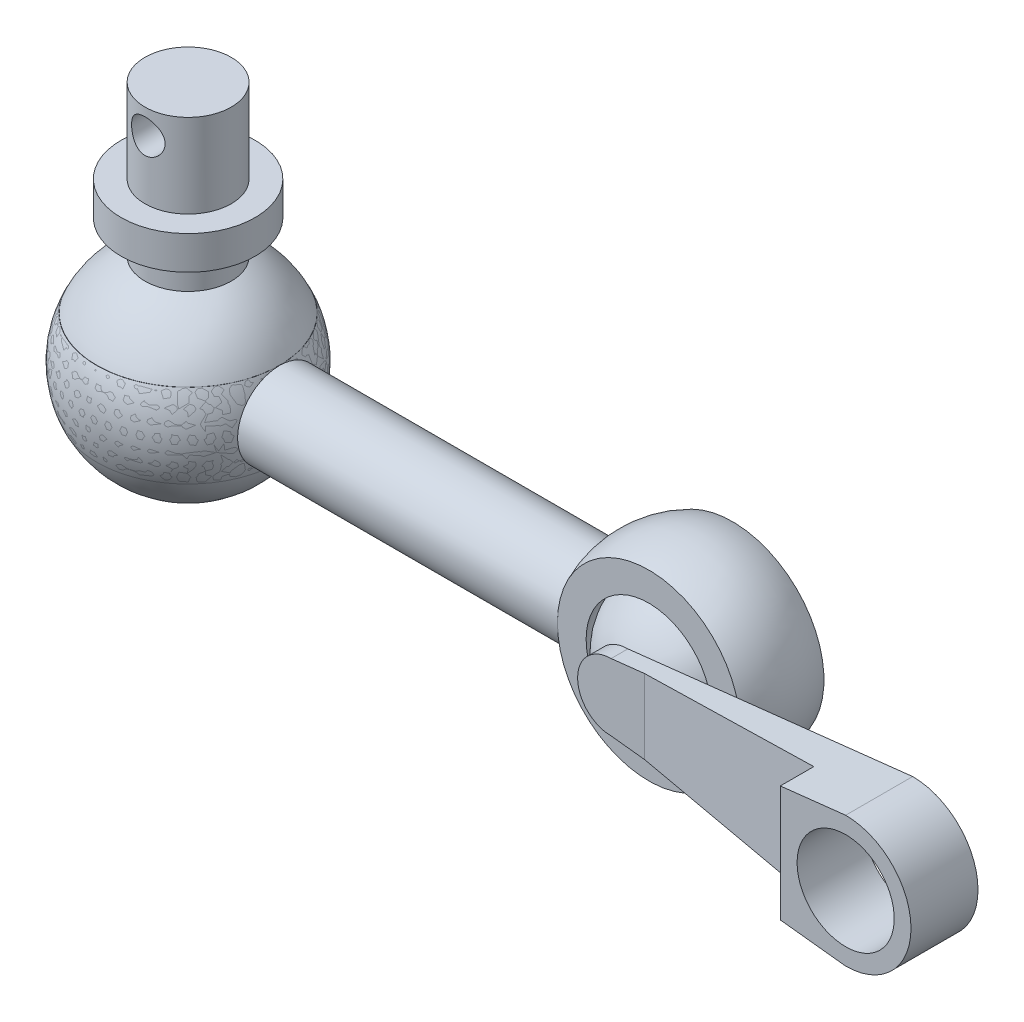
ISO-10303-21;
HEADER;
FILE_DESCRIPTION(('STEP AP214'),'2;1');
FILE_NAME('part.step','',(''),(''),'','','');
FILE_SCHEMA(('AUTOMOTIVE_DESIGN { 1 0 10303 214 1 1 1 1 }'));
ENDSEC;
DATA;
#1=APPLICATION_CONTEXT('core data for automotive mechanical design processes');
#2=APPLICATION_PROTOCOL_DEFINITION('international standard','automotive_design',2000,#1);
#3=PRODUCT_CONTEXT('',#1,'mechanical');
#4=PRODUCT('Part','Part','',(#3));
#5=PRODUCT_RELATED_PRODUCT_CATEGORY('part','',(#4));
#6=PRODUCT_DEFINITION_FORMATION('','',#4);
#7=PRODUCT_DEFINITION_CONTEXT('part definition',#1,'design');
#8=PRODUCT_DEFINITION('design','',#6,#7);
#9=PRODUCT_DEFINITION_SHAPE('','',#8);
#10=(LENGTH_UNIT() NAMED_UNIT(*) SI_UNIT(.MILLI.,.METRE.));
#11=(NAMED_UNIT(*) PLANE_ANGLE_UNIT() SI_UNIT($,.RADIAN.));
#12=(NAMED_UNIT(*) SI_UNIT($,.STERADIAN.) SOLID_ANGLE_UNIT());
#13=UNCERTAINTY_MEASURE_WITH_UNIT(LENGTH_MEASURE(1.E-05),#10,'distance_accuracy_value','');
#14=(GEOMETRIC_REPRESENTATION_CONTEXT(3) GLOBAL_UNCERTAINTY_ASSIGNED_CONTEXT((#13)) GLOBAL_UNIT_ASSIGNED_CONTEXT((#10,
#11,#12)) REPRESENTATION_CONTEXT('',''));
#15=CARTESIAN_POINT('',(0.,0.,0.));
#16=DIRECTION('',(0.,0.,1.));
#17=DIRECTION('',(1.,0.,0.));
#18=AXIS2_PLACEMENT_3D('',#15,#16,#17);
#19=CARTESIAN_POINT('',(-10.,14.4193518985207,0.));
#20=DIRECTION('',(0.,-1.,0.));
#21=DIRECTION('',(0.,0.,-1.));
#22=AXIS2_PLACEMENT_3D('',#19,#20,#21);
#23=CYLINDRICAL_SURFACE('',#22,2.575);
#24=CARTESIAN_POINT('',(-10.,5.41935189852071,0.));
#25=DIRECTION('',(0.,-1.,0.));
#26=DIRECTION('',(0.,0.,-1.));
#27=AXIS2_PLACEMENT_3D('',#24,#25,#26);
#28=CIRCLE('',#27,2.575);
#29=CARTESIAN_POINT('',(-10.,5.41935189852071,-2.575));
#30=VERTEX_POINT('',#29);
#31=EDGE_CURVE('E75',#30,#30,#28,.T.);
#32=ORIENTED_EDGE('',*,*,#31,.F.);
#33=EDGE_LOOP('',(#32));
#34=FACE_BOUND('',#33,.T.);
#35=CARTESIAN_POINT('',(-10.,7.41935189852071,0.));
#36=DIRECTION('',(0.,1.,0.));
#37=DIRECTION('',(0.,0.,1.));
#38=AXIS2_PLACEMENT_3D('',#35,#36,#37);
#39=CIRCLE('',#38,2.575);
#40=CARTESIAN_POINT('',(-10.,7.41935189852071,2.575));
#41=VERTEX_POINT('',#40);
#42=EDGE_CURVE('E79',#41,#41,#39,.F.);
#43=ORIENTED_EDGE('',*,*,#42,.T.);
#44=EDGE_LOOP('',(#43));
#45=FACE_BOUND('',#44,.T.);
#46=ADVANCED_FACE('F56',(#34,#45),#23,.T.);
#47=CARTESIAN_POINT('',(-10.,0.,0.));
#48=DIRECTION('',(0.,0.,-1.));
#49=DIRECTION('',(1.,0.,0.));
#50=AXIS2_PLACEMENT_3D('',#47,#48,#49);
#51=SPHERICAL_SURFACE('',#50,6.);
#52=CARTESIAN_POINT('',(-10.,0.,0.));
#53=DIRECTION('',(0.,-1.,0.));
#54=DIRECTION('',(0.,0.,-1.));
#55=AXIS2_PLACEMENT_3D('',#52,#53,#54);
#56=SPHERICAL_SURFACE('',#55,6.);
#57=ORIENTED_EDGE('',*,*,#31,.T.);
#58=EDGE_LOOP('',(#57));
#59=FACE_BOUND('',#58,.T.);
#60=ADVANCED_FACE('F58',(#59),#56,.T.);
#61=CARTESIAN_POINT('',(-10.,7.41935189852071,0.));
#62=DIRECTION('',(0.,1.,0.));
#63=DIRECTION('',(0.,0.,1.));
#64=AXIS2_PLACEMENT_3D('',#61,#62,#63);
#65=CYLINDRICAL_SURFACE('',#64,4.);
#66=CARTESIAN_POINT('',(-10.,7.41935189852071,0.));
#67=DIRECTION('',(0.,1.,0.));
#68=DIRECTION('',(0.,0.,1.));
#69=AXIS2_PLACEMENT_3D('',#66,#67,#68);
#70=CIRCLE('',#69,4.);
#71=CARTESIAN_POINT('',(-10.,7.41935189852071,4.));
#72=VERTEX_POINT('',#71);
#73=EDGE_CURVE('E82',#72,#72,#70,.T.);
#74=ORIENTED_EDGE('',*,*,#73,.T.);
#75=EDGE_LOOP('',(#74));
#76=FACE_BOUND('',#75,.T.);
#77=CARTESIAN_POINT('',(-10.,9.41935189852071,0.));
#78=DIRECTION('',(0.,1.,0.));
#79=DIRECTION('',(0.,0.,1.));
#80=AXIS2_PLACEMENT_3D('',#77,#78,#79);
#81=CIRCLE('',#80,4.);
#82=CARTESIAN_POINT('',(-10.,9.41935189852071,4.));
#83=VERTEX_POINT('',#82);
#84=EDGE_CURVE('E130',#83,#83,#81,.T.);
#85=ORIENTED_EDGE('',*,*,#84,.F.);
#86=EDGE_LOOP('',(#85));
#87=FACE_BOUND('',#86,.T.);
#88=ADVANCED_FACE('F102',(#76,#87),#65,.T.);
#89=CARTESIAN_POINT('',(-10.,7.41935189852071,0.));
#90=DIRECTION('',(0.,1.,0.));
#91=DIRECTION('',(0.,0.,1.));
#92=AXIS2_PLACEMENT_3D('',#89,#90,#91);
#93=PLANE('',#92);
#94=ORIENTED_EDGE('',*,*,#42,.F.);
#95=EDGE_LOOP('',(#94));
#96=FACE_BOUND('',#95,.T.);
#97=ORIENTED_EDGE('',*,*,#73,.F.);
#98=EDGE_LOOP('',(#97));
#99=FACE_BOUND('',#98,.T.);
#100=ADVANCED_FACE('F97',(#96,#99),#93,.F.);
#101=CARTESIAN_POINT('',(-10.,9.41935189852071,0.));
#102=DIRECTION('',(0.,1.,0.));
#103=DIRECTION('',(0.,0.,1.));
#104=AXIS2_PLACEMENT_3D('',#101,#102,#103);
#105=PLANE('',#104);
#106=CARTESIAN_POINT('',(-10.,9.41935189852071,0.));
#107=DIRECTION('',(0.,1.,0.));
#108=DIRECTION('',(0.,0.,1.));
#109=AXIS2_PLACEMENT_3D('',#106,#107,#108);
#110=CIRCLE('',#109,2.575);
#111=CARTESIAN_POINT('',(-10.,9.41935189852071,2.575));
#112=VERTEX_POINT('',#111);
#113=EDGE_CURVE('E11',#112,#112,#110,.F.);
#114=ORIENTED_EDGE('',*,*,#113,.T.);
#115=EDGE_LOOP('',(#114));
#116=FACE_BOUND('',#115,.T.);
#117=ORIENTED_EDGE('',*,*,#84,.T.);
#118=EDGE_LOOP('',(#117));
#119=FACE_BOUND('',#118,.T.);
#120=ADVANCED_FACE('F101',(#116,#119),#105,.T.);
#121=CARTESIAN_POINT('',(-10.,14.4193518985207,0.));
#122=DIRECTION('',(0.,-1.,0.));
#123=DIRECTION('',(0.,0.,-1.));
#124=AXIS2_PLACEMENT_3D('',#121,#122,#123);
#125=PLANE('',#124);
#126=CARTESIAN_POINT('',(-10.,14.4193518985207,0.));
#127=DIRECTION('',(0.,-1.,0.));
#128=DIRECTION('',(0.,0.,-1.));
#129=AXIS2_PLACEMENT_3D('',#126,#127,#128);
#130=CIRCLE('',#129,2.575);
#131=CARTESIAN_POINT('',(-10.,14.4193518985207,-2.575));
#132=VERTEX_POINT('',#131);
#133=EDGE_CURVE('E69',#132,#132,#130,.T.);
#134=ORIENTED_EDGE('',*,*,#133,.F.);
#135=EDGE_LOOP('',(#134));
#136=FACE_BOUND('',#135,.T.);
#137=ADVANCED_FACE('F106',(#136),#125,.F.);
#138=CARTESIAN_POINT('',(-10.,13.9193518985207,-2.575));
#139=CARTESIAN_POINT('',(-9.94598196417157,13.9193545319205,-2.57500202020831));
#140=CARTESIAN_POINT('',(-9.89198126517657,13.9149615384662,-2.57328576143806));
#141=CARTESIAN_POINT('',(-9.78560114290195,13.8975829049149,-2.56661179565357));
#142=CARTESIAN_POINT('',(-9.73322136286806,13.8845991698708,-2.56165480729517));
#143=CARTESIAN_POINT('',(-9.63163334036611,13.8505725164533,-2.5490291436732));
#144=CARTESIAN_POINT('',(-9.58241894229532,13.8295458287623,-2.54136593194541));
#145=CARTESIAN_POINT('',(-9.48822196124736,13.7801158082344,-2.52408485470617));
#146=CARTESIAN_POINT('',(-9.4432405994588,13.7517103555307,-2.51446642764823));
#147=CARTESIAN_POINT('',(-9.35675955485384,13.6869950061235,-2.49377713838037));
#148=CARTESIAN_POINT('',(-9.3154754569615,13.6504109460672,-2.48266315409782));
#149=CARTESIAN_POINT('',(-9.2394520168924,13.5709588971021,-2.46043965654122));
#150=CARTESIAN_POINT('',(-9.2047148944388,13.528088785663,-2.44933014605331));
#151=CARTESIAN_POINT('',(-9.14135046540315,13.4351172564039,-2.42786189997238));
#152=CARTESIAN_POINT('',(-9.11303619512266,13.3847897142586,-2.4175533903381));
#153=CARTESIAN_POINT('',(-9.0653705100488,13.279624607916,-2.39953056855961));
#154=CARTESIAN_POINT('',(-9.04601521937903,13.2247890061308,-2.39181513498294));
#155=CARTESIAN_POINT('',(-9.01768206013176,13.1146524326942,-2.38031562665857));
#156=CARTESIAN_POINT('',(-9.00829069145281,13.0594746901743,-2.37637562211495));
#157=CARTESIAN_POINT('',(-8.99885958898506,12.9481965535794,-2.37241896101786));
#158=CARTESIAN_POINT('',(-8.99881562451987,12.8920965884047,-2.37240052954313));
#159=CARTESIAN_POINT('',(-9.00776594571579,12.784447738116,-2.37615542191099));
#160=CARTESIAN_POINT('',(-9.01617357691923,12.732839859323,-2.37968263056429));
#161=CARTESIAN_POINT('',(-9.04081418567609,12.6318349875057,-2.38972020963061));
#162=CARTESIAN_POINT('',(-9.05704843077623,12.5824383540168,-2.39623106324662));
#163=CARTESIAN_POINT('',(-9.0971836245972,12.4861084572214,-2.41164172599468));
#164=CARTESIAN_POINT('',(-9.12122958203577,12.4392430653078,-2.42058615420337));
#165=CARTESIAN_POINT('',(-9.17620420474751,12.350047423678,-2.43984266313875));
#166=CARTESIAN_POINT('',(-9.20713536314075,12.3077188249733,-2.45015523872153));
#167=CARTESIAN_POINT('',(-9.27764014807991,12.2255697278204,-2.47189728271559));
#168=CARTESIAN_POINT('',(-9.31767774039379,12.1861534913115,-2.4833535232273));
#169=CARTESIAN_POINT('',(-9.40392164928938,12.1144697227771,-2.50545313557303));
#170=CARTESIAN_POINT('',(-9.45012905391357,12.0822034543191,-2.51609636351116));
#171=CARTESIAN_POINT('',(-9.54849275857656,12.0252456977093,-2.53561051281034));
#172=CARTESIAN_POINT('',(-9.60073969273101,12.0006980181776,-2.54444682205218));
#173=CARTESIAN_POINT('',(-9.70905106014246,11.9608773339081,-2.55909226395576));
#174=CARTESIAN_POINT('',(-9.76511365555317,11.9455998987477,-2.56490284248199));
#175=CARTESIAN_POINT('',(-9.87606977364287,11.9255517961292,-2.57258301348776));
#176=CARTESIAN_POINT('',(-9.93085101032327,11.9202373333669,-2.57465632348392));
#177=CARTESIAN_POINT('',(-10.0405559640455,11.9186708641898,-2.57526430115713));
#178=CARTESIAN_POINT('',(-10.0954796435391,11.922416672493,-2.57379982212742));
#179=CARTESIAN_POINT('',(-10.2015001176001,11.9384579929973,-2.56763069814744));
#180=CARTESIAN_POINT('',(-10.252660896299,11.9503894113612,-2.56306411595425));
#181=CARTESIAN_POINT('',(-10.3522125225232,11.981975447423,-2.55129098982339));
#182=CARTESIAN_POINT('',(-10.4006030105273,12.0016310649568,-2.54408410412771));
#183=CARTESIAN_POINT('',(-10.49487579574,12.0487438495482,-2.5274659377553));
#184=CARTESIAN_POINT('',(-10.5406387836596,12.0764179990203,-2.51799484394173));
#185=CARTESIAN_POINT('',(-10.6270290171614,12.138539540553,-2.49788512964893));
#186=CARTESIAN_POINT('',(-10.6676542656993,12.1729895531843,-2.48724605815898));
#187=CARTESIAN_POINT('',(-10.7452656660809,12.2502044071986,-2.46514360030111));
#188=CARTESIAN_POINT('',(-10.7818677699965,12.2933533918107,-2.45367013250662));
#189=CARTESIAN_POINT('',(-10.8473972558849,12.385395459796,-2.43181812116348));
#190=CARTESIAN_POINT('',(-10.8763236621416,12.4342892722991,-2.42143971691756));
#191=CARTESIAN_POINT('',(-10.9257864530962,12.5370050140208,-2.40296690118517));
#192=CARTESIAN_POINT('',(-10.9462633953624,12.5908587036367,-2.39488879144378));
#193=CARTESIAN_POINT('',(-10.9777107441161,12.7016550923468,-2.38222576682967));
#194=CARTESIAN_POINT('',(-10.9886876228288,12.7585956602577,-2.37763847398278));
#195=CARTESIAN_POINT('',(-11.0002233571887,12.869754735289,-2.37280713114832));
#196=CARTESIAN_POINT('',(-11.0014432149608,12.9238931648275,-2.3722875630662));
#197=CARTESIAN_POINT('',(-10.9951461388551,13.0315623021259,-2.37493593622861));
#198=CARTESIAN_POINT('',(-10.9876301656668,13.0850930760568,-2.37810347199808));
#199=CARTESIAN_POINT('',(-10.9646030841093,13.1881089538643,-2.38753245871056));
#200=CARTESIAN_POINT('',(-10.9493820642966,13.2376701170206,-2.39368133314559));
#201=CARTESIAN_POINT('',(-10.9116407659019,13.3335594654832,-2.40830721592465));
#202=CARTESIAN_POINT('',(-10.8891185825765,13.3798868033051,-2.41678483170761));
#203=CARTESIAN_POINT('',(-10.835978386513,13.4707697696613,-2.43569313924826));
#204=CARTESIAN_POINT('',(-10.8049829184611,13.5150874295667,-2.44620566247344));
#205=CARTESIAN_POINT('',(-10.7363428424124,13.5981024992748,-2.46773521000198));
#206=CARTESIAN_POINT('',(-10.6986960455568,13.6367980512578,-2.47875239949711));
#207=CARTESIAN_POINT('',(-10.6151395048416,13.7098335442399,-2.50084014954054));
#208=CARTESIAN_POINT('',(-10.5688706146481,13.743775481345,-2.511874621721));
#209=CARTESIAN_POINT('',(-10.4708951926625,13.8034033860674,-2.53207096339836));
#210=CARTESIAN_POINT('',(-10.4191875527012,13.8290876668095,-2.54123245014254));
#211=CARTESIAN_POINT('',(-10.3077285756035,13.8728419814703,-2.55720926083415));
#212=CARTESIAN_POINT('',(-10.247665160113,13.8902080364775,-2.56380084015179));
#213=CARTESIAN_POINT('',(-10.1250590776848,13.9134580119137,-2.57269374819017));
#214=CARTESIAN_POINT('',(-10.0625179277962,13.919348850748,-2.57499766190615));
#215=CARTESIAN_POINT('',(-10.,13.9193518985207,-2.575));
#216=B_SPLINE_CURVE_WITH_KNOTS('',3,(#138,#139,#140,#141,#142,#143,#144,#145,#146,#147,#148,
#149,#150,#151,#152,#153,#154,#155,#156,#157,#158,#159,#160,#161,#162,#163,#164,#165,#166,#167,
#168,#169,#170,#171,#172,#173,#174,#175,#176,#177,#178,#179,#180,#181,#182,#183,#184,#185,#186,
#187,#188,#189,#190,#191,#192,#193,#194,#195,#196,#197,#198,#199,#200,#201,#202,#203,#204,#205,
#206,#207,#208,#209,#210,#211,#212,#213,#214,#215),.UNSPECIFIED.,.T.,.F.,(4,2,2,2,2,2,2,2,2,2,2,
2,2,2,2,2,2,2,2,2,2,2,2,2,2,2,2,2,2,2,2,2,2,2,2,2,2,2,4),(0.,0.16182335653588,0.323610839708562,
0.48507354354909,0.646582685878313,0.814650984615308,0.982776164062116,1.15787204904241,
1.33289211224296,1.50032481927737,1.66768174536844,1.82417244143809,1.98068849022575,
2.14029403098458,2.29995745893453,2.47119528451056,2.64246334774995,2.816755512432,
2.99096431389817,3.15535149698836,3.31969903484621,3.47717366752633,3.63466869075676,
3.79690345655607,3.95920109060367,4.13160340909105,4.30402763245806,4.47764499812386,
4.65114398802828,4.81278021313224,4.9743986645931,5.13034052424342,5.28632309912933,
5.45089344347825,5.61551804683457,5.78997183004547,5.96446122808932,6.15186096948282,
6.33914769260211),.UNSPECIFIED.);
#217=CARTESIAN_POINT('',(-10.,13.9193518985207,-2.575));
#218=VERTEX_POINT('',#217);
#219=EDGE_CURVE('E60',#218,#218,#216,.T.);
#220=ORIENTED_EDGE('',*,*,#219,.F.);
#221=EDGE_LOOP('',(#220));
#222=FACE_BOUND('',#221,.T.);
#223=CARTESIAN_POINT('',(-9.,12.9193518985207,2.37289380293346));
#224=CARTESIAN_POINT('',(-8.99999722139201,12.9731956963913,2.37289110703922));
#225=CARTESIAN_POINT('',(-9.00436306477362,13.0270220113793,2.37474628804675));
#226=CARTESIAN_POINT('',(-9.02162394626962,13.1330425170059,2.38190933636265));
#227=CARTESIAN_POINT('',(-9.03451827462539,13.1852368430835,2.38721691635445));
#228=CARTESIAN_POINT('',(-9.06828401353924,13.2864289181166,2.4005947825806));
#229=CARTESIAN_POINT('',(-9.08913505256395,13.3354344593196,2.4086580080876));
#230=CARTESIAN_POINT('',(-9.13814947187162,13.4292714132584,2.42662686896339));
#231=CARTESIAN_POINT('',(-9.1663152071987,13.474101475327,2.43653309741466));
#232=CARTESIAN_POINT('',(-9.23076980343275,13.5607085347316,2.45766406625231));
#233=CARTESIAN_POINT('',(-9.26738674188519,13.602231513926,2.46892947630691));
#234=CARTESIAN_POINT('',(-9.34700961508583,13.6787283438743,2.49117158556141));
#235=CARTESIAN_POINT('',(-9.39001703897059,13.713700663862,2.5021482167653));
#236=CARTESIAN_POINT('',(-9.48315268074377,13.7773522341795,2.52306384162644));
#237=CARTESIAN_POINT('',(-9.53348497699474,13.8057519203593,2.53294965652845));
#238=CARTESIAN_POINT('',(-9.63866519536014,13.8535739311938,2.55007746006612));
#239=CARTESIAN_POINT('',(-9.69351141948203,13.872999613556,2.55732043733067));
#240=CARTESIAN_POINT('',(-9.80348967137155,13.9014209060698,2.56805748696161));
#241=CARTESIAN_POINT('',(-9.8584928644417,13.910854599552,2.57170847051306));
#242=CARTESIAN_POINT('',(-9.96941478063441,13.920431497705,2.57541540833563));
#243=CARTESIAN_POINT('',(-10.0253331776073,13.9205779429286,2.57547261656462));
#244=CARTESIAN_POINT('',(-10.1333442906611,13.9118234008255,2.57208307770772));
#245=CARTESIAN_POINT('',(-10.1854826955811,13.9034015051913,2.56882187534662));
#246=CARTESIAN_POINT('',(-10.2875389686504,13.8785599961424,2.55940886299085));
#247=CARTESIAN_POINT('',(-10.3374566782244,13.8621398125834,2.55325684693052));
#248=CARTESIAN_POINT('',(-10.434538695127,13.821563653402,2.53855262879303));
#249=CARTESIAN_POINT('',(-10.481651048113,13.7972963224797,2.52996611007672));
#250=CARTESIAN_POINT('',(-10.5712545341302,13.741816200813,2.51125297236053));
#251=CARTESIAN_POINT('',(-10.6137441147352,13.710601087507,2.50112583871044));
#252=CARTESIAN_POINT('',(-10.695704773575,13.6398415283469,2.47962212426884));
#253=CARTESIAN_POINT('',(-10.7348228389742,13.5998992955461,2.46820700933151));
#254=CARTESIAN_POINT('',(-10.8059446608192,13.5139654764864,2.44590893495758));
#255=CARTESIAN_POINT('',(-10.8379463545879,13.4679721424511,2.43502613052205));
#256=CARTESIAN_POINT('',(-10.894670445971,13.3697516414276,2.41477177715309));
#257=CARTESIAN_POINT('',(-10.9191882016004,13.3173962019266,2.4054454270646));
#258=CARTESIAN_POINT('',(-10.9589218468026,13.2088413409554,2.38988591201063));
#259=CARTESIAN_POINT('',(-10.9741433659475,13.1526442688583,2.38365087545314));
#260=CARTESIAN_POINT('',(-10.9940201197142,13.0415084918789,2.37542811129013));
#261=CARTESIAN_POINT('',(-10.9992401629802,12.9866877515748,2.37321374534176));
#262=CARTESIAN_POINT('',(-11.0006047681901,12.8769209114902,2.37263920756646));
#263=CARTESIAN_POINT('',(-10.9967518438862,12.8219748506448,2.37427796819392));
#264=CARTESIAN_POINT('',(-10.9805931842005,12.7165380875055,2.38099356145834));
#265=CARTESIAN_POINT('',(-10.968740721158,12.6659647587067,2.38588583492128));
#266=CARTESIAN_POINT('',(-10.9374990359452,12.5675531255467,2.39833301362071));
#267=CARTESIAN_POINT('',(-10.9181082024604,12.5197154084273,2.40588848807984));
#268=CARTESIAN_POINT('',(-10.8714889533196,12.4260459973105,2.4231738153985));
#269=CARTESIAN_POINT('',(-10.8439832798072,12.380366286046,2.43297724911016));
#270=CARTESIAN_POINT('',(-10.7822039459643,12.2940716013629,2.45353634502014));
#271=CARTESIAN_POINT('',(-10.7479276578357,12.253458604445,2.46429237604177));
#272=CARTESIAN_POINT('',(-10.6707905576045,12.1755460156238,2.48643942392621));
#273=CARTESIAN_POINT('',(-10.6275011424035,12.1386671608946,2.49782316390602));
#274=CARTESIAN_POINT('',(-10.5350722737991,12.0726390043634,2.51924002603058));
#275=CARTESIAN_POINT('',(-10.4859326922862,12.0434898718754,2.52927311858801));
#276=CARTESIAN_POINT('',(-10.383128030888,11.993899550187,2.54687044534589));
#277=CARTESIAN_POINT('',(-10.329471626682,11.9734421039148,2.55443928247501));
#278=CARTESIAN_POINT('',(-10.2191151452634,11.9419695786399,2.56625916219579));
#279=CARTESIAN_POINT('',(-10.1624166313792,11.9309496981714,2.57051189179506));
#280=CARTESIAN_POINT('',(-10.0513746196656,11.9192104447306,2.57504984444644));
#281=CARTESIAN_POINT('',(-9.9971030124827,11.9178948913841,2.5755646704982));
#282=CARTESIAN_POINT('',(-9.88914214179202,11.924046567434,2.57317884957177));
#283=CARTESIAN_POINT('',(-9.8354528001899,11.9315126039524,2.57027866648323));
#284=CARTESIAN_POINT('',(-9.73169629647778,11.9545923596593,2.56149899898285));
#285=CARTESIAN_POINT('',(-9.68157002487588,11.9699750489403,2.55570412363877));
#286=CARTESIAN_POINT('',(-9.58461252205062,12.0082148550711,2.54174739125638));
#287=CARTESIAN_POINT('',(-9.53778191626191,12.0310733860248,2.53358508643655));
#288=CARTESIAN_POINT('',(-9.44652046887879,12.0847365035664,2.51526254047434));
#289=CARTESIAN_POINT('',(-9.40228130138262,12.1158422620756,2.50503109969879));
#290=CARTESIAN_POINT('',(-9.31947125220292,12.1846536597519,2.48381480573653));
#291=CARTESIAN_POINT('',(-9.28090245511714,12.2223617150146,2.4728296776377));
#292=CARTESIAN_POINT('',(-9.20823623065356,12.3058812887901,2.45056374356294));
#293=CARTESIAN_POINT('',(-9.17452366111942,12.3520341839583,2.43930228133211));
#294=CARTESIAN_POINT('',(-9.11530176469186,12.4497014717521,2.41845470426931));
#295=CARTESIAN_POINT('',(-9.08979447954664,12.5012171946137,2.40886900669393));
#296=CARTESIAN_POINT('',(-9.04629568074599,12.6123258610656,2.39200007506613));
#297=CARTESIAN_POINT('',(-9.02901285215146,12.6722348663282,2.38494394784019));
#298=CARTESIAN_POINT('',(-9.00587122459908,12.7945557429926,2.37539421190936));
#299=CARTESIAN_POINT('',(-9.00000321944583,12.8569655559629,2.37289692654264));
#300=CARTESIAN_POINT('',(-9.,12.9193518985207,2.37289380293346));
#301=B_SPLINE_CURVE_WITH_KNOTS('',3,(#223,#224,#225,#226,#227,#228,#229,#230,#231,#232,#233,
#234,#235,#236,#237,#238,#239,#240,#241,#242,#243,#244,#245,#246,#247,#248,#249,#250,#251,#252,
#253,#254,#255,#256,#257,#258,#259,#260,#261,#262,#263,#264,#265,#266,#267,#268,#269,#270,#271,
#272,#273,#274,#275,#276,#277,#278,#279,#280,#281,#282,#283,#284,#285,#286,#287,#288,#289,#290,
#291,#292,#293,#294,#295,#296,#297,#298,#299,#300),.UNSPECIFIED.,.T.,.F.,(4,2,2,2,2,2,2,2,2,2,2,
2,2,2,2,2,2,2,2,2,2,2,2,2,2,2,2,2,2,2,2,2,2,2,2,2,2,2,4),(0.,0.161298664945342,
0.322583907962413,0.483458953923206,0.644385859663743,0.813128434683467,0.981910392619475,
1.15691529204258,1.33185465860584,1.49875886072,1.66560482547043,1.82360815485302,
1.9816227488841,2.1419860355942,2.30240301058531,2.4728148460387,2.64327601108817,
2.81804968707077,2.99271741919704,3.15719148100923,3.32161997907773,3.47743677135151,
3.63328688754012,3.7952419217215,3.95725993753205,4.13043454071765,4.30361293685287,
4.47646597586736,4.64923102165965,4.81128638795473,4.97331974343492,5.13087214736615,
5.28845437060739,5.45285897825545,5.617323875627,5.79124986187043,5.96521909327809,
6.15225938184183,6.33914875746837),.UNSPECIFIED.);
#302=CARTESIAN_POINT('',(-9.,12.9193518985207,2.37289380293346));
#303=VERTEX_POINT('',#302);
#304=EDGE_CURVE('E83',#303,#303,#301,.T.);
#305=ORIENTED_EDGE('',*,*,#304,.F.);
#306=EDGE_LOOP('',(#305));
#307=FACE_BOUND('',#306,.T.);
#308=ORIENTED_EDGE('',*,*,#113,.F.);
#309=EDGE_LOOP('',(#308));
#310=FACE_BOUND('',#309,.T.);
#311=ORIENTED_EDGE('',*,*,#133,.T.);
#312=EDGE_LOOP('',(#311));
#313=FACE_BOUND('',#312,.T.);
#314=ADVANCED_FACE('F89',(#222,#307,#310,#313),#23,.T.);
#315=CARTESIAN_POINT('',(-10.,12.9193518985207,-6.));
#316=DIRECTION('',(0.,0.,1.));
#317=DIRECTION('',(1.,0.,0.));
#318=AXIS2_PLACEMENT_3D('',#315,#316,#317);
#319=CYLINDRICAL_SURFACE('',#318,1.);
#320=ORIENTED_EDGE('',*,*,#219,.T.);
#321=EDGE_LOOP('',(#320));
#322=FACE_BOUND('',#321,.T.);
#323=ORIENTED_EDGE('',*,*,#304,.T.);
#324=EDGE_LOOP('',(#323));
#325=FACE_BOUND('',#324,.T.);
#326=ADVANCED_FACE('F92',(#322,#325),#319,.F.);
#327=CLOSED_SHELL('',(#46,#60,#88,#100,#120,#137,#314,#326));
#328=MANIFOLD_SOLID_BREP('B2',#327);
#329=CARTESIAN_POINT('',(20.,0.,8.75));
#330=DIRECTION('',(0.,0.,-1.));
#331=DIRECTION('',(-1.,0.,0.));
#332=AXIS2_PLACEMENT_3D('',#329,#330,#331);
#333=CYLINDRICAL_SURFACE('',#332,2.);
#334=DIRECTION('',(0.,0.,-1.));
#335=VECTOR('',#334,1.);
#336=CARTESIAN_POINT('',(20.,-2.,7.75));
#337=LINE('',#336,#335);
#338=CARTESIAN_POINT('',(20.,-2.,4.75));
#339=VERTEX_POINT('',#338);
#340=CARTESIAN_POINT('',(20.,-2.,3.75));
#341=VERTEX_POINT('',#340);
#342=EDGE_CURVE('E260',#339,#341,#337,.T.);
#343=ORIENTED_EDGE('',*,*,#342,.F.);
#344=CARTESIAN_POINT('',(20.,0.,4.75));
#345=DIRECTION('',(0.,0.,-1.));
#346=DIRECTION('',(-1.,0.,0.));
#347=AXIS2_PLACEMENT_3D('',#344,#345,#346);
#348=CIRCLE('',#347,2.);
#349=CARTESIAN_POINT('',(20.,2.,4.75));
#350=VERTEX_POINT('',#349);
#351=EDGE_CURVE('E305',#350,#339,#348,.F.);
#352=ORIENTED_EDGE('',*,*,#351,.F.);
#353=DIRECTION('',(0.,0.,-1.));
#354=VECTOR('',#353,1.);
#355=CARTESIAN_POINT('',(20.,2.,7.75));
#356=LINE('',#355,#354);
#357=CARTESIAN_POINT('',(20.,2.,3.75));
#358=VERTEX_POINT('',#357);
#359=EDGE_CURVE('E329',#350,#358,#356,.T.);
#360=ORIENTED_EDGE('',*,*,#359,.T.);
#361=CARTESIAN_POINT('',(20.,0.,3.75));
#362=DIRECTION('',(0.,0.,-1.));
#363=DIRECTION('',(-1.,0.,0.));
#364=AXIS2_PLACEMENT_3D('',#361,#362,#363);
#365=CIRCLE('',#364,2.);
#366=EDGE_CURVE('E343',#341,#358,#365,.T.);
#367=ORIENTED_EDGE('',*,*,#366,.F.);
#368=EDGE_LOOP('',(#343,#352,#360,#367));
#369=FACE_BOUND('',#368,.T.);
#370=ADVANCED_FACE('F236',(#369),#333,.T.);
#371=CARTESIAN_POINT('',(20.,0.,0.));
#372=DIRECTION('',(0.,1.,0.));
#373=DIRECTION('',(1.,0.,0.));
#374=AXIS2_PLACEMENT_3D('',#371,#372,#373);
#375=SPHERICAL_SURFACE('',#374,4.25);
#376=CARTESIAN_POINT('',(20.,0.,0.));
#377=DIRECTION('',(0.,0.,-1.));
#378=DIRECTION('',(-1.,0.,0.));
#379=AXIS2_PLACEMENT_3D('',#376,#377,#378);
#380=SPHERICAL_SURFACE('',#379,4.25);
#381=EDGE_CURVE('E344',#358,#341,#365,.T.);
#382=ORIENTED_EDGE('',*,*,#381,.T.);
#383=ORIENTED_EDGE('',*,*,#366,.T.);
#384=EDGE_LOOP('',(#382,#383));
#385=FACE_BOUND('',#384,.T.);
#386=ADVANCED_FACE('F238',(#385),#380,.T.);
#387=CARTESIAN_POINT('',(20.,-2.,7.75));
#388=DIRECTION('',(0.111073132195895,0.993812235436953,0.));
#389=DIRECTION('',(-0.993812235436953,0.111073132195895,0.));
#390=AXIS2_PLACEMENT_3D('',#387,#388,#389);
#391=PLANE('',#390);
#392=DIRECTION('',(0.993812235436953,-0.111073132195895,0.));
#393=VECTOR('',#392,1.);
#394=CARTESIAN_POINT('',(20.,-2.,7.75));
#395=LINE('',#394,#393);
#396=CARTESIAN_POINT('',(33.1,-3.46411764705882,7.75));
#397=VERTEX_POINT('',#396);
#398=CARTESIAN_POINT('',(37.,-3.9,7.75));
#399=VERTEX_POINT('',#398);
#400=EDGE_CURVE('E314',#397,#399,#395,.T.);
#401=ORIENTED_EDGE('',*,*,#400,.F.);
#402=DIRECTION('',(0.,0.,-1.));
#403=VECTOR('',#402,1.);
#404=CARTESIAN_POINT('',(33.1,-3.46411764705882,7.75));
#405=LINE('',#404,#403);
#406=CARTESIAN_POINT('',(33.1,-3.46411764705882,5.75));
#407=VERTEX_POINT('',#406);
#408=EDGE_CURVE('E252',#397,#407,#405,.T.);
#409=ORIENTED_EDGE('',*,*,#408,.T.);
#410=DIRECTION('',(-0.98985277871428,0.110630604679831,-0.0891759260102955));
#411=VECTOR('',#410,1.);
#412=CARTESIAN_POINT('',(20.2807178060267,-2.03137434302651,4.59510971225466));
#413=LINE('',#412,#411);
#414=CARTESIAN_POINT('',(22.,-2.22352941176471,4.75));
#415=VERTEX_POINT('',#414);
#416=EDGE_CURVE('E299',#407,#415,#413,.T.);
#417=ORIENTED_EDGE('',*,*,#416,.T.);
#418=DIRECTION('',(-0.993812235436953,0.111073132195895,0.));
#419=VECTOR('',#418,1.);
#420=CARTESIAN_POINT('',(20.,-2.,4.75));
#421=LINE('',#420,#419);
#422=EDGE_CURVE('E319',#415,#339,#421,.T.);
#423=ORIENTED_EDGE('',*,*,#422,.T.);
#424=ORIENTED_EDGE('',*,*,#342,.T.);
#425=DIRECTION('',(0.993812235436953,-0.111073132195895,0.));
#426=VECTOR('',#425,1.);
#427=CARTESIAN_POINT('',(20.,-2.,3.75));
#428=LINE('',#427,#426);
#429=CARTESIAN_POINT('',(37.,-3.9,3.75));
#430=VERTEX_POINT('',#429);
#431=EDGE_CURVE('E321',#341,#430,#428,.T.);
#432=ORIENTED_EDGE('',*,*,#431,.T.);
#433=DIRECTION('',(0.,0.,-1.));
#434=VECTOR('',#433,1.);
#435=CARTESIAN_POINT('',(37.,-3.9,7.75));
#436=LINE('',#435,#434);
#437=EDGE_CURVE('E339',#399,#430,#436,.T.);
#438=ORIENTED_EDGE('',*,*,#437,.F.);
#439=EDGE_LOOP('',(#401,#409,#417,#423,#424,#432,#438));
#440=FACE_BOUND('',#439,.T.);
#441=ADVANCED_FACE('F312',(#440),#391,.F.);
#442=CARTESIAN_POINT('',(37.,0.,7.75));
#443=DIRECTION('',(0.,0.,-1.));
#444=DIRECTION('',(-1.,0.,0.));
#445=AXIS2_PLACEMENT_3D('',#442,#443,#444);
#446=CYLINDRICAL_SURFACE('',#445,3.9);
#447=CARTESIAN_POINT('',(37.,0.,3.75));
#448=DIRECTION('',(0.,0.,1.));
#449=DIRECTION('',(1.,0.,0.));
#450=AXIS2_PLACEMENT_3D('',#447,#448,#449);
#451=CIRCLE('',#450,3.9);
#452=CARTESIAN_POINT('',(37.,3.9,3.75));
#453=VERTEX_POINT('',#452);
#454=EDGE_CURVE('E331',#430,#453,#451,.T.);
#455=ORIENTED_EDGE('',*,*,#454,.T.);
#456=DIRECTION('',(0.,0.,-1.));
#457=VECTOR('',#456,1.);
#458=CARTESIAN_POINT('',(37.,3.9,7.75));
#459=LINE('',#458,#457);
#460=CARTESIAN_POINT('',(37.,3.9,7.75));
#461=VERTEX_POINT('',#460);
#462=EDGE_CURVE('E336',#461,#453,#459,.T.);
#463=ORIENTED_EDGE('',*,*,#462,.F.);
#464=CARTESIAN_POINT('',(37.,0.,7.75));
#465=DIRECTION('',(0.,0.,1.));
#466=DIRECTION('',(1.,0.,0.));
#467=AXIS2_PLACEMENT_3D('',#464,#465,#466);
#468=CIRCLE('',#467,3.9);
#469=EDGE_CURVE('E323',#399,#461,#468,.T.);
#470=ORIENTED_EDGE('',*,*,#469,.F.);
#471=ORIENTED_EDGE('',*,*,#437,.T.);
#472=EDGE_LOOP('',(#455,#463,#470,#471));
#473=FACE_BOUND('',#472,.T.);
#474=ADVANCED_FACE('F386',(#473),#446,.T.);
#475=CARTESIAN_POINT('',(20.,2.,7.75));
#476=DIRECTION('',(0.111073132195895,-0.993812235436953,0.));
#477=DIRECTION('',(0.993812235436953,0.111073132195895,0.));
#478=AXIS2_PLACEMENT_3D('',#475,#476,#477);
#479=PLANE('',#478);
#480=DIRECTION('',(0.98985277871428,0.110630604679831,0.0891759260102955));
#481=VECTOR('',#480,1.);
#482=CARTESIAN_POINT('',(20.2807178060267,2.03137434302651,4.59510971225466));
#483=LINE('',#482,#481);
#484=CARTESIAN_POINT('',(22.,2.22352941176471,4.75));
#485=VERTEX_POINT('',#484);
#486=CARTESIAN_POINT('',(33.1,3.46411764705882,5.75));
#487=VERTEX_POINT('',#486);
#488=EDGE_CURVE('E245',#485,#487,#483,.T.);
#489=ORIENTED_EDGE('',*,*,#488,.T.);
#490=DIRECTION('',(0.,0.,1.));
#491=VECTOR('',#490,1.);
#492=CARTESIAN_POINT('',(33.1,3.46411764705882,7.75));
#493=LINE('',#492,#491);
#494=CARTESIAN_POINT('',(33.1,3.46411764705882,7.75));
#495=VERTEX_POINT('',#494);
#496=EDGE_CURVE('E309',#487,#495,#493,.T.);
#497=ORIENTED_EDGE('',*,*,#496,.T.);
#498=DIRECTION('',(-0.993812235436953,-0.111073132195895,0.));
#499=VECTOR('',#498,1.);
#500=CARTESIAN_POINT('',(20.,2.,7.75));
#501=LINE('',#500,#499);
#502=EDGE_CURVE('E326',#461,#495,#501,.T.);
#503=ORIENTED_EDGE('',*,*,#502,.F.);
#504=ORIENTED_EDGE('',*,*,#462,.T.);
#505=DIRECTION('',(-0.993812235436953,-0.111073132195895,0.));
#506=VECTOR('',#505,1.);
#507=CARTESIAN_POINT('',(20.,2.,3.75));
#508=LINE('',#507,#506);
#509=EDGE_CURVE('E324',#453,#358,#508,.T.);
#510=ORIENTED_EDGE('',*,*,#509,.T.);
#511=ORIENTED_EDGE('',*,*,#359,.F.);
#512=DIRECTION('',(0.993812235436953,0.111073132195895,0.));
#513=VECTOR('',#512,1.);
#514=CARTESIAN_POINT('',(20.,2.,4.75));
#515=LINE('',#514,#513);
#516=EDGE_CURVE('E54',#350,#485,#515,.T.);
#517=ORIENTED_EDGE('',*,*,#516,.T.);
#518=EDGE_LOOP('',(#489,#497,#503,#504,#510,#511,#517));
#519=FACE_BOUND('',#518,.T.);
#520=ADVANCED_FACE('F350',(#519),#479,.F.);
#521=CARTESIAN_POINT('',(20.,0.,7.75));
#522=DIRECTION('',(0.,0.,1.));
#523=DIRECTION('',(1.,0.,0.));
#524=AXIS2_PLACEMENT_3D('',#521,#522,#523);
#525=PLANE('',#524);
#526=CARTESIAN_POINT('',(37.,0.,7.75));
#527=DIRECTION('',(0.,0.,-1.));
#528=DIRECTION('',(-1.,0.,0.));
#529=AXIS2_PLACEMENT_3D('',#526,#527,#528);
#530=CIRCLE('',#529,2.9);
#531=CARTESIAN_POINT('',(34.1,0.,7.75));
#532=VERTEX_POINT('',#531);
#533=EDGE_CURVE('E358',#532,#532,#530,.T.);
#534=ORIENTED_EDGE('',*,*,#533,.T.);
#535=EDGE_LOOP('',(#534));
#536=FACE_BOUND('',#535,.T.);
#537=DIRECTION('',(0.,1.,0.));
#538=VECTOR('',#537,1.);
#539=CARTESIAN_POINT('',(33.1,0.,7.75));
#540=LINE('',#539,#538);
#541=EDGE_CURVE('E347',#397,#495,#540,.T.);
#542=ORIENTED_EDGE('',*,*,#541,.F.);
#543=ORIENTED_EDGE('',*,*,#400,.T.);
#544=ORIENTED_EDGE('',*,*,#469,.T.);
#545=ORIENTED_EDGE('',*,*,#502,.T.);
#546=EDGE_LOOP('',(#542,#543,#544,#545));
#547=FACE_BOUND('',#546,.T.);
#548=ADVANCED_FACE('F392',(#536,#547),#525,.T.);
#549=CARTESIAN_POINT('',(20.,0.,3.75));
#550=DIRECTION('',(0.,0.,1.));
#551=DIRECTION('',(1.,0.,0.));
#552=AXIS2_PLACEMENT_3D('',#549,#550,#551);
#553=PLANE('',#552);
#554=CARTESIAN_POINT('',(37.,0.,3.75));
#555=DIRECTION('',(0.,0.,1.));
#556=DIRECTION('',(1.,0.,0.));
#557=AXIS2_PLACEMENT_3D('',#554,#555,#556);
#558=CIRCLE('',#557,2.9);
#559=CARTESIAN_POINT('',(39.9,0.,3.75));
#560=VERTEX_POINT('',#559);
#561=EDGE_CURVE('E240',#560,#560,#558,.T.);
#562=ORIENTED_EDGE('',*,*,#561,.T.);
#563=EDGE_LOOP('',(#562));
#564=FACE_BOUND('',#563,.T.);
#565=ORIENTED_EDGE('',*,*,#431,.F.);
#566=ORIENTED_EDGE('',*,*,#381,.F.);
#567=ORIENTED_EDGE('',*,*,#509,.F.);
#568=ORIENTED_EDGE('',*,*,#454,.F.);
#569=EDGE_LOOP('',(#565,#566,#567,#568));
#570=FACE_BOUND('',#569,.T.);
#571=ADVANCED_FACE('F365',(#564,#570),#553,.F.);
#572=CARTESIAN_POINT('',(18.,-6.,4.75));
#573=DIRECTION('',(0.,0.,-1.));
#574=DIRECTION('',(-1.,0.,0.));
#575=AXIS2_PLACEMENT_3D('',#572,#573,#574);
#576=PLANE('',#575);
#577=DIRECTION('',(0.,1.,0.));
#578=VECTOR('',#577,1.);
#579=CARTESIAN_POINT('',(22.,-6.,4.75));
#580=LINE('',#579,#578);
#581=EDGE_CURVE('E304',#415,#485,#580,.T.);
#582=ORIENTED_EDGE('',*,*,#581,.T.);
#583=ORIENTED_EDGE('',*,*,#516,.F.);
#584=ORIENTED_EDGE('',*,*,#351,.T.);
#585=ORIENTED_EDGE('',*,*,#422,.F.);
#586=EDGE_LOOP('',(#582,#583,#584,#585));
#587=FACE_BOUND('',#586,.T.);
#588=ADVANCED_FACE('F354',(#587),#576,.F.);
#589=CARTESIAN_POINT('',(22.,-6.,4.75));
#590=DIRECTION('',(0.0897267048962129,0.,-0.995966424347964));
#591=DIRECTION('',(-0.995966424347964,0.,-0.0897267048962129));
#592=AXIS2_PLACEMENT_3D('',#589,#590,#591);
#593=PLANE('',#592);
#594=DIRECTION('',(0.,1.,0.));
#595=VECTOR('',#594,1.);
#596=CARTESIAN_POINT('',(33.1,-6.,5.75));
#597=LINE('',#596,#595);
#598=EDGE_CURVE('E301',#407,#487,#597,.T.);
#599=ORIENTED_EDGE('',*,*,#598,.T.);
#600=ORIENTED_EDGE('',*,*,#488,.F.);
#601=ORIENTED_EDGE('',*,*,#581,.F.);
#602=ORIENTED_EDGE('',*,*,#416,.F.);
#603=EDGE_LOOP('',(#599,#600,#601,#602));
#604=FACE_BOUND('',#603,.T.);
#605=ADVANCED_FACE('F300',(#604),#593,.F.);
#606=CARTESIAN_POINT('',(33.1,-6.,5.75));
#607=DIRECTION('',(1.,0.,0.));
#608=DIRECTION('',(0.,0.,-1.));
#609=AXIS2_PLACEMENT_3D('',#606,#607,#608);
#610=PLANE('',#609);
#611=ORIENTED_EDGE('',*,*,#541,.T.);
#612=ORIENTED_EDGE('',*,*,#496,.F.);
#613=ORIENTED_EDGE('',*,*,#598,.F.);
#614=ORIENTED_EDGE('',*,*,#408,.F.);
#615=EDGE_LOOP('',(#611,#612,#613,#614));
#616=FACE_BOUND('',#615,.T.);
#617=ADVANCED_FACE('F307',(#616),#610,.F.);
#618=CARTESIAN_POINT('',(37.,0.,7.75));
#619=DIRECTION('',(0.,0.,-1.));
#620=DIRECTION('',(-1.,0.,0.));
#621=AXIS2_PLACEMENT_3D('',#618,#619,#620);
#622=CYLINDRICAL_SURFACE('',#621,2.9);
#623=ORIENTED_EDGE('',*,*,#533,.F.);
#624=EDGE_LOOP('',(#623));
#625=FACE_BOUND('',#624,.T.);
#626=ORIENTED_EDGE('',*,*,#561,.F.);
#627=EDGE_LOOP('',(#626));
#628=FACE_BOUND('',#627,.T.);
#629=ADVANCED_FACE('F368',(#625,#628),#622,.F.);
#630=CLOSED_SHELL('',(#370,#386,#441,#474,#520,#548,#571,#588,#605,#617,#629));
#631=MANIFOLD_SOLID_BREP('B6',#630);
#632=CARTESIAN_POINT('',(26.001,0.,0.));
#633=DIRECTION('',(-1.,0.,0.));
#634=DIRECTION('',(0.,0.,1.));
#635=AXIS2_PLACEMENT_3D('',#632,#633,#634);
#636=CYLINDRICAL_SURFACE('',#635,2.5);
#637=CARTESIAN_POINT('',(-4.54564394268214,0.,0.));
#638=DIRECTION('',(-1.,0.,0.));
#639=DIRECTION('',(0.,0.,1.));
#640=AXIS2_PLACEMENT_3D('',#637,#638,#639);
#641=CIRCLE('',#640,2.5);
#642=CARTESIAN_POINT('',(-4.54564394268214,2.5,0.));
#643=VERTEX_POINT('',#642);
#644=CARTESIAN_POINT('',(-4.54564394268214,-2.5,0.));
#645=VERTEX_POINT('',#644);
#646=EDGE_CURVE('E234',#643,#645,#641,.T.);
#647=ORIENTED_EDGE('',*,*,#646,.F.);
#648=EDGE_CURVE('E525',#645,#643,#641,.T.);
#649=ORIENTED_EDGE('',*,*,#648,.F.);
#650=EDGE_LOOP('',(#647,#649));
#651=FACE_BOUND('',#650,.T.);
#652=CARTESIAN_POINT('',(14.5456439426821,0.,0.));
#653=DIRECTION('',(1.,0.,0.));
#654=DIRECTION('',(0.,0.,-1.));
#655=AXIS2_PLACEMENT_3D('',#652,#653,#654);
#656=CIRCLE('',#655,2.5);
#657=CARTESIAN_POINT('',(14.5456439426821,0.,-2.5));
#658=VERTEX_POINT('',#657);
#659=CARTESIAN_POINT('',(14.5456439426821,0.,2.5));
#660=VERTEX_POINT('',#659);
#661=EDGE_CURVE('E552',#658,#660,#656,.F.);
#662=ORIENTED_EDGE('',*,*,#661,.T.);
#663=EDGE_CURVE('E550',#660,#658,#656,.F.);
#664=ORIENTED_EDGE('',*,*,#663,.T.);
#665=EDGE_LOOP('',(#662,#664));
#666=FACE_BOUND('',#665,.T.);
#667=ADVANCED_FACE('F516',(#651,#666),#636,.T.);
#668=CARTESIAN_POINT('',(20.,0.,0.));
#669=DIRECTION('',(0.,0.,-1.));
#670=DIRECTION('',(1.,0.,0.));
#671=AXIS2_PLACEMENT_3D('',#668,#669,#670);
#672=SPHERICAL_SURFACE('',#671,6.);
#673=CARTESIAN_POINT('',(20.,0.,-2.5));
#674=DIRECTION('',(0.,0.,1.));
#675=DIRECTION('',(1.,0.,0.));
#676=AXIS2_PLACEMENT_3D('',#673,#674,#675);
#677=CIRCLE('',#676,5.45435605731786);
#678=EDGE_CURVE('E547',#658,#658,#677,.T.);
#679=ORIENTED_EDGE('',*,*,#678,.T.);
#680=ORIENTED_EDGE('',*,*,#663,.F.);
#681=CARTESIAN_POINT('',(20.,0.,2.5));
#682=DIRECTION('',(0.,0.,-1.));
#683=DIRECTION('',(-1.,0.,0.));
#684=AXIS2_PLACEMENT_3D('',#681,#682,#683);
#685=CIRCLE('',#684,5.45435605731786);
#686=EDGE_CURVE('E531',#660,#660,#685,.T.);
#687=ORIENTED_EDGE('',*,*,#686,.T.);
#688=ORIENTED_EDGE('',*,*,#661,.F.);
#689=EDGE_LOOP('',(#679,#680,#687,#688));
#690=FACE_BOUND('',#689,.T.);
#691=ADVANCED_FACE('F548',(#690),#672,.T.);
#692=CARTESIAN_POINT('',(-10.,0.,0.));
#693=DIRECTION('',(0.,0.,-1.));
#694=DIRECTION('',(1.,0.,0.));
#695=AXIS2_PLACEMENT_3D('',#692,#693,#694);
#696=SPHERICAL_SURFACE('',#695,6.);
#697=CARTESIAN_POINT('',(-10.,2.5,0.));
#698=DIRECTION('',(0.,-1.,0.));
#699=DIRECTION('',(1.,0.,0.));
#700=AXIS2_PLACEMENT_3D('',#697,#698,#699);
#701=CIRCLE('',#700,5.45435605731786);
#702=EDGE_CURVE('E563',#643,#643,#701,.F.);
#703=ORIENTED_EDGE('',*,*,#702,.F.);
#704=ORIENTED_EDGE('',*,*,#646,.T.);
#705=CARTESIAN_POINT('',(-10.,-2.5,0.));
#706=DIRECTION('',(0.,1.,0.));
#707=DIRECTION('',(-1.,0.,0.));
#708=AXIS2_PLACEMENT_3D('',#705,#706,#707);
#709=CIRCLE('',#708,5.45435605731786);
#710=EDGE_CURVE('E537',#645,#645,#709,.F.);
#711=ORIENTED_EDGE('',*,*,#710,.F.);
#712=ORIENTED_EDGE('',*,*,#648,.T.);
#713=EDGE_LOOP('',(#703,#704,#711,#712));
#714=FACE_BOUND('',#713,.T.);
#715=ADVANCED_FACE('F593',(#714),#696,.T.);
#716=CARTESIAN_POINT('',(-15.4543560573179,-2.5,-6.));
#717=DIRECTION('',(0.,1.,0.));
#718=DIRECTION('',(-1.,0.,0.));
#719=AXIS2_PLACEMENT_3D('',#716,#717,#718);
#720=PLANE('',#719);
#721=ORIENTED_EDGE('',*,*,#710,.T.);
#722=EDGE_LOOP('',(#721));
#723=FACE_BOUND('',#722,.T.);
#724=CARTESIAN_POINT('',(-10.,-2.5,0.));
#725=DIRECTION('',(0.,1.,0.));
#726=DIRECTION('',(-1.,0.,0.));
#727=AXIS2_PLACEMENT_3D('',#724,#725,#726);
#728=CIRCLE('',#727,3.74165738677394);
#729=CARTESIAN_POINT('',(-13.7416573867739,-2.5,0.));
#730=VERTEX_POINT('',#729);
#731=EDGE_CURVE('E554',#730,#730,#728,.T.);
#732=ORIENTED_EDGE('',*,*,#731,.T.);
#733=EDGE_LOOP('',(#732));
#734=FACE_BOUND('',#733,.T.);
#735=ADVANCED_FACE('F599',(#723,#734),#720,.F.);
#736=CARTESIAN_POINT('',(-15.4543560573179,2.5,-6.));
#737=DIRECTION('',(0.,-1.,0.));
#738=DIRECTION('',(1.,0.,0.));
#739=AXIS2_PLACEMENT_3D('',#736,#737,#738);
#740=PLANE('',#739);
#741=ORIENTED_EDGE('',*,*,#702,.T.);
#742=EDGE_LOOP('',(#741));
#743=FACE_BOUND('',#742,.T.);
#744=CARTESIAN_POINT('',(-10.,2.5,0.));
#745=DIRECTION('',(0.,-1.,0.));
#746=DIRECTION('',(1.,0.,0.));
#747=AXIS2_PLACEMENT_3D('',#744,#745,#746);
#748=CIRCLE('',#747,3.74165738677394);
#749=CARTESIAN_POINT('',(-6.25834261322606,2.5,0.));
#750=VERTEX_POINT('',#749);
#751=EDGE_CURVE('E562',#750,#750,#748,.T.);
#752=ORIENTED_EDGE('',*,*,#751,.T.);
#753=EDGE_LOOP('',(#752));
#754=FACE_BOUND('',#753,.T.);
#755=ADVANCED_FACE('F583',(#743,#754),#740,.F.);
#756=CARTESIAN_POINT('',(-10.,0.,0.));
#757=DIRECTION('',(0.,0.,-1.));
#758=DIRECTION('',(-1.,0.,0.));
#759=AXIS2_PLACEMENT_3D('',#756,#757,#758);
#760=SPHERICAL_SURFACE('',#759,4.5);
#761=CARTESIAN_POINT('',(-10.,0.,0.));
#762=DIRECTION('',(0.,-1.,0.));
#763=DIRECTION('',(1.,0.,0.));
#764=AXIS2_PLACEMENT_3D('',#761,#762,#763);
#765=SPHERICAL_SURFACE('',#764,4.5);
#766=ORIENTED_EDGE('',*,*,#751,.F.);
#767=EDGE_LOOP('',(#766));
#768=FACE_BOUND('',#767,.T.);
#769=ORIENTED_EDGE('',*,*,#731,.F.);
#770=EDGE_LOOP('',(#769));
#771=FACE_BOUND('',#770,.T.);
#772=ADVANCED_FACE('F575',(#768,#771),#765,.F.);
#773=CARTESIAN_POINT('',(14.5456439426821,-6.,2.5));
#774=DIRECTION('',(0.,0.,-1.));
#775=DIRECTION('',(-1.,0.,0.));
#776=AXIS2_PLACEMENT_3D('',#773,#774,#775);
#777=PLANE('',#776);
#778=CARTESIAN_POINT('',(20.,0.,2.5));
#779=DIRECTION('',(0.,0.,-1.));
#780=DIRECTION('',(-1.,0.,0.));
#781=AXIS2_PLACEMENT_3D('',#778,#779,#780);
#782=CIRCLE('',#781,3.74165738677394);
#783=CARTESIAN_POINT('',(16.2583426132261,0.,2.5));
#784=VERTEX_POINT('',#783);
#785=EDGE_CURVE('E567',#784,#784,#782,.F.);
#786=ORIENTED_EDGE('',*,*,#785,.F.);
#787=EDGE_LOOP('',(#786));
#788=FACE_BOUND('',#787,.T.);
#789=ORIENTED_EDGE('',*,*,#686,.F.);
#790=EDGE_LOOP('',(#789));
#791=FACE_BOUND('',#790,.T.);
#792=ADVANCED_FACE('F572',(#788,#791),#777,.F.);
#793=CARTESIAN_POINT('',(14.5456439426821,-6.,-2.5));
#794=DIRECTION('',(0.,0.,1.));
#795=DIRECTION('',(1.,0.,0.));
#796=AXIS2_PLACEMENT_3D('',#793,#794,#795);
#797=PLANE('',#796);
#798=CARTESIAN_POINT('',(20.,0.,-2.5));
#799=DIRECTION('',(0.,0.,1.));
#800=DIRECTION('',(1.,0.,0.));
#801=AXIS2_PLACEMENT_3D('',#798,#799,#800);
#802=CIRCLE('',#801,3.74165738677394);
#803=CARTESIAN_POINT('',(16.2583426132261,0.,-2.5));
#804=VERTEX_POINT('',#803);
#805=EDGE_CURVE('E520',#804,#804,#802,.F.);
#806=ORIENTED_EDGE('',*,*,#805,.F.);
#807=EDGE_LOOP('',(#806));
#808=FACE_BOUND('',#807,.T.);
#809=ORIENTED_EDGE('',*,*,#678,.F.);
#810=EDGE_LOOP('',(#809));
#811=FACE_BOUND('',#810,.T.);
#812=ADVANCED_FACE('F574',(#808,#811),#797,.F.);
#813=CARTESIAN_POINT('',(20.,0.,0.));
#814=DIRECTION('',(0.,0.,-1.));
#815=DIRECTION('',(-1.,0.,0.));
#816=AXIS2_PLACEMENT_3D('',#813,#814,#815);
#817=SPHERICAL_SURFACE('',#816,4.5);
#818=CARTESIAN_POINT('',(16.2583426132261,0.,-2.5));
#819=CARTESIAN_POINT('',(16.2276634959773,0.,-2.45408459164375));
#820=CARTESIAN_POINT('',(16.1978303834313,0.,-2.40760396055003));
#821=CARTESIAN_POINT('',(16.1398947464703,0.,-2.3135763807479));
#822=CARTESIAN_POINT('',(16.1117922220552,0.,-2.26602943203949));
#823=CARTESIAN_POINT('',(16.0573563400813,0.,-2.16993334486826));
#824=CARTESIAN_POINT('',(16.0310229825224,0.,-2.12138420640542));
#825=CARTESIAN_POINT('',(15.9801609871042,0.,-2.02334961289457));
#826=CARTESIAN_POINT('',(15.955632349245,0.,-1.97386415784654));
#827=CARTESIAN_POINT('',(15.9084130687825,0.,-1.87402396943581));
#828=CARTESIAN_POINT('',(15.8857224261794,0.,-1.82366923607311));
#829=CARTESIAN_POINT('',(15.8422098759103,0.,-1.72215873510485));
#830=CARTESIAN_POINT('',(15.8213879682443,0.,-1.67100296749929));
#831=CARTESIAN_POINT('',(15.7816411072044,0.,-1.56795972018962));
#832=CARTESIAN_POINT('',(15.7627161538304,0.,-1.51607224048551));
#833=CARTESIAN_POINT('',(15.726788846833,0.,-1.41163588469828));
#834=CARTESIAN_POINT('',(15.7097864932096,0.,-1.35908700861517));
#835=CARTESIAN_POINT('',(15.6777274266295,0.,-1.25339907154574));
#836=CARTESIAN_POINT('',(15.6626707136729,0.,-1.20026001055943));
#837=CARTESIAN_POINT('',(15.634523332476,0.,-1.09346371509155));
#838=CARTESIAN_POINT('',(15.6214326642357,0.,-1.03980648060998));
#839=CARTESIAN_POINT('',(15.5972351122986,0.,-0.932046551723737));
#840=CARTESIAN_POINT('',(15.5861282286018,0.,-0.877943857319061));
#841=CARTESIAN_POINT('',(15.5659132972371,0.,-0.769366325833882));
#842=CARTESIAN_POINT('',(15.5568052495692,0.,-0.714891488753379));
#843=CARTESIAN_POINT('',(15.5406003330307,0.,-0.605643493470074));
#844=CARTESIAN_POINT('',(15.53350346416,0.,-0.55087033526727));
#845=CARTESIAN_POINT('',(15.5213305225346,0.,-0.441099923563377));
#846=CARTESIAN_POINT('',(15.5162544497798,0.,-0.386102670062287));
#847=CARTESIAN_POINT('',(15.5081299792245,0.,-0.275958597268296));
#848=CARTESIAN_POINT('',(15.5050815814238,0.,-0.220811777975394));
#849=CARTESIAN_POINT('',(15.5010165918116,0.,-0.110443305788328));
#850=CARTESIAN_POINT('',(15.5,0.,-0.0552216528941643));
#851=CARTESIAN_POINT('',(15.5,0.,0.0552216528941643));
#852=CARTESIAN_POINT('',(15.5010165918116,0.,0.110443305788328));
#853=CARTESIAN_POINT('',(15.5050815814238,0.,0.220811777975394));
#854=CARTESIAN_POINT('',(15.5081299792245,0.,0.275958597268296));
#855=CARTESIAN_POINT('',(15.5162544497798,0.,0.386102670062287));
#856=CARTESIAN_POINT('',(15.5213305225346,0.,0.441099923563377));
#857=CARTESIAN_POINT('',(15.53350346416,0.,0.55087033526727));
#858=CARTESIAN_POINT('',(15.5406003330307,0.,0.605643493470073));
#859=CARTESIAN_POINT('',(15.5568052495692,0.,0.714891488753379));
#860=CARTESIAN_POINT('',(15.5659132972371,0.,0.769366325833882));
#861=CARTESIAN_POINT('',(15.5861282286018,0.,0.877943857319061));
#862=CARTESIAN_POINT('',(15.5972351122986,0.,0.932046551723737));
#863=CARTESIAN_POINT('',(15.6214326642357,0.,1.03980648060998));
#864=CARTESIAN_POINT('',(15.634523332476,0.,1.09346371509155));
#865=CARTESIAN_POINT('',(15.6626707136729,0.,1.20026001055943));
#866=CARTESIAN_POINT('',(15.6777274266295,0.,1.25339907154574));
#867=CARTESIAN_POINT('',(15.7097864932096,0.,1.35908700861517));
#868=CARTESIAN_POINT('',(15.726788846833,0.,1.41163588469828));
#869=CARTESIAN_POINT('',(15.7627161538304,0.,1.51607224048551));
#870=CARTESIAN_POINT('',(15.7816411072044,0.,1.56795972018962));
#871=CARTESIAN_POINT('',(15.8213879682443,0.,1.67100296749929));
#872=CARTESIAN_POINT('',(15.8422098759103,0.,1.72215873510485));
#873=CARTESIAN_POINT('',(15.8857224261794,0.,1.82366923607311));
#874=CARTESIAN_POINT('',(15.9084130687825,0.,1.87402396943581));
#875=CARTESIAN_POINT('',(15.955632349245,0.,1.97386415784654));
#876=CARTESIAN_POINT('',(15.9801609871042,0.,2.02334961289457));
#877=CARTESIAN_POINT('',(16.0310229825224,0.,2.12138420640542));
#878=CARTESIAN_POINT('',(16.0573563400813,0.,2.16993334486826));
#879=CARTESIAN_POINT('',(16.1117922220552,0.,2.26602943203949));
#880=CARTESIAN_POINT('',(16.1398947464703,0.,2.3135763807479));
#881=CARTESIAN_POINT('',(16.1978303834313,0.,2.40760396055003));
#882=CARTESIAN_POINT('',(16.2276634959773,0.,2.45408459164375));
#883=CARTESIAN_POINT('',(16.2583426132261,0.,2.5));
#884=B_SPLINE_CURVE_WITH_KNOTS('',3,(#818,#819,#820,#821,#822,#823,#824,#825,#826,#827,#828,
#829,#830,#831,#832,#833,#834,#835,#836,#837,#838,#839,#840,#841,#842,#843,#844,#845,#846,#847,
#848,#849,#850,#851,#852,#853,#854,#855,#856,#857,#858,#859,#860,#861,#862,#863,#864,#865,#866,
#867,#868,#869,#870,#871,#872,#873,#874,#875,#876,#877,#878,#879,#880,#881,#882,#883),
.UNSPECIFIED.,.F.,.F.,(4,2,2,2,2,2,2,2,2,2,2,2,2,2,2,2,2,2,2,2,2,2,2,2,2,2,2,2,2,2,2,2,4),(0.,
0.165655605275009,0.331311210550019,0.496966815825029,0.662622421100038,0.828278026375047,
0.993933631650058,1.15958923692507,1.32524484220008,1.49090044747509,1.6565560527501,
1.82221165802511,1.98786726330012,2.15352286857512,2.31917847385013,2.48483407912514,
2.65048968440015,2.81614528967516,2.98180089495017,3.14745650022518,3.31311210550019,
3.4787677107752,3.64442331605021,3.81007892132522,3.97573452660023,4.14139013187524,
4.30704573715025,4.47270134242526,4.63835694770027,4.80401255297528,4.96966815825029,
5.1353237635253,5.30097936880031),.UNSPECIFIED.);
#885=EDGE_CURVE('BSEAM518',#804,#784,#884,.T.);
#886=ORIENTED_EDGE('',*,*,#805,.T.);
#887=ORIENTED_EDGE('',*,*,#785,.T.);
#888=ORIENTED_EDGE('',*,*,#885,.T.);
#889=ORIENTED_EDGE('',*,*,#885,.F.);
#890=EDGE_LOOP('',(#886,#888,#887,#889));
#891=FACE_BOUND('',#890,.T.);
#892=ADVANCED_FACE('F518',(#891),#817,.F.);
#893=CLOSED_SHELL('',(#667,#691,#715,#735,#755,#772,#792,#812,#892));
#894=MANIFOLD_SOLID_BREP('B48',#893);
#895=ADVANCED_BREP_SHAPE_REPRESENTATION('',(#18,#328,#631,#894),#14);
#896=SHAPE_DEFINITION_REPRESENTATION(#9,#895);
ENDSEC;
END-ISO-10303-21;
